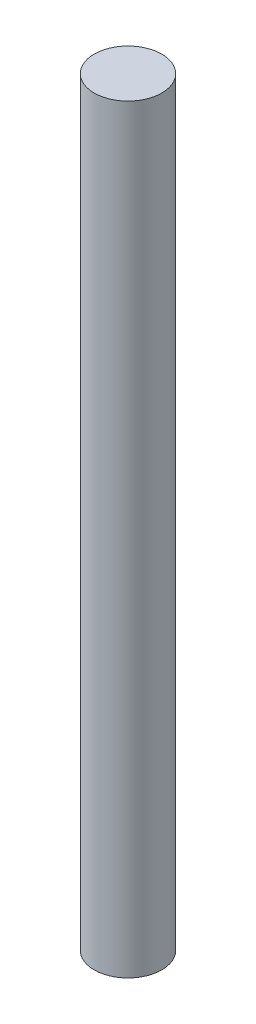
ISO-10303-21;
HEADER;
FILE_DESCRIPTION(('STEP AP214'),'2;1');
FILE_NAME('part.step','',(''),(''),'','','');
FILE_SCHEMA(('AUTOMOTIVE_DESIGN { 1 0 10303 214 1 1 1 1 }'));
ENDSEC;
DATA;
#1=APPLICATION_CONTEXT('core data for automotive mechanical design processes');
#2=APPLICATION_PROTOCOL_DEFINITION('international standard','automotive_design',2000,#1);
#3=PRODUCT_CONTEXT('',#1,'mechanical');
#4=PRODUCT('Part','Part','',(#3));
#5=PRODUCT_RELATED_PRODUCT_CATEGORY('part','',(#4));
#6=PRODUCT_DEFINITION_FORMATION('','',#4);
#7=PRODUCT_DEFINITION_CONTEXT('part definition',#1,'design');
#8=PRODUCT_DEFINITION('design','',#6,#7);
#9=PRODUCT_DEFINITION_SHAPE('','',#8);
#10=(LENGTH_UNIT() NAMED_UNIT(*) SI_UNIT(.MILLI.,.METRE.));
#11=(NAMED_UNIT(*) PLANE_ANGLE_UNIT() SI_UNIT($,.RADIAN.));
#12=(NAMED_UNIT(*) SI_UNIT($,.STERADIAN.) SOLID_ANGLE_UNIT());
#13=UNCERTAINTY_MEASURE_WITH_UNIT(LENGTH_MEASURE(1.E-05),#10,'distance_accuracy_value','');
#14=(GEOMETRIC_REPRESENTATION_CONTEXT(3) GLOBAL_UNCERTAINTY_ASSIGNED_CONTEXT((#13)) GLOBAL_UNIT_ASSIGNED_CONTEXT((#10,
#11,#12)) REPRESENTATION_CONTEXT('',''));
#15=CARTESIAN_POINT('',(0.,0.,0.));
#16=DIRECTION('',(0.,0.,1.));
#17=DIRECTION('',(1.,0.,0.));
#18=AXIS2_PLACEMENT_3D('',#15,#16,#17);
#19=CARTESIAN_POINT('',(0.,22.86,0.));
#20=DIRECTION('',(0.,-1.,0.));
#21=DIRECTION('',(0.,0.,-1.));
#22=AXIS2_PLACEMENT_3D('',#19,#20,#21);
#23=CYLINDRICAL_SURFACE('',#22,1.016);
#24=CARTESIAN_POINT('',(0.,22.86,0.));
#25=DIRECTION('',(0.,1.,0.));
#26=DIRECTION('',(0.,0.,1.));
#27=AXIS2_PLACEMENT_3D('',#24,#25,#26);
#28=CIRCLE('',#27,1.016);
#29=CARTESIAN_POINT('',(0.,22.86,1.016));
#30=VERTEX_POINT('',#29);
#31=EDGE_CURVE('E10',#30,#30,#28,.T.);
#32=ORIENTED_EDGE('',*,*,#31,.F.);
#33=EDGE_LOOP('',(#32));
#34=FACE_BOUND('',#33,.T.);
#35=CARTESIAN_POINT('',(0.,0.,0.));
#36=DIRECTION('',(0.,1.,0.));
#37=DIRECTION('',(0.,0.,1.));
#38=AXIS2_PLACEMENT_3D('',#35,#36,#37);
#39=CIRCLE('',#38,1.016);
#40=CARTESIAN_POINT('',(0.,0.,1.016));
#41=VERTEX_POINT('',#40);
#42=EDGE_CURVE('E38',#41,#41,#39,.T.);
#43=ORIENTED_EDGE('',*,*,#42,.T.);
#44=EDGE_LOOP('',(#43));
#45=FACE_BOUND('',#44,.T.);
#46=ADVANCED_FACE('F35',(#34,#45),#23,.T.);
#47=CARTESIAN_POINT('',(0.,22.86,0.));
#48=DIRECTION('',(0.,1.,0.));
#49=DIRECTION('',(0.,0.,1.));
#50=AXIS2_PLACEMENT_3D('',#47,#48,#49);
#51=PLANE('',#50);
#52=ORIENTED_EDGE('',*,*,#31,.T.);
#53=EDGE_LOOP('',(#52));
#54=FACE_BOUND('',#53,.T.);
#55=ADVANCED_FACE('F50',(#54),#51,.T.);
#56=CARTESIAN_POINT('',(0.,0.,0.));
#57=DIRECTION('',(0.,1.,0.));
#58=DIRECTION('',(0.,0.,1.));
#59=AXIS2_PLACEMENT_3D('',#56,#57,#58);
#60=PLANE('',#59);
#61=ORIENTED_EDGE('',*,*,#42,.F.);
#62=EDGE_LOOP('',(#61));
#63=FACE_BOUND('',#62,.T.);
#64=ADVANCED_FACE('F48',(#63),#60,.F.);
#65=CLOSED_SHELL('',(#46,#55,#64));
#66=MANIFOLD_SOLID_BREP('B2',#65);
#67=ADVANCED_BREP_SHAPE_REPRESENTATION('',(#18,#66),#14);
#68=SHAPE_DEFINITION_REPRESENTATION(#9,#67);
ENDSEC;
END-ISO-10303-21;
